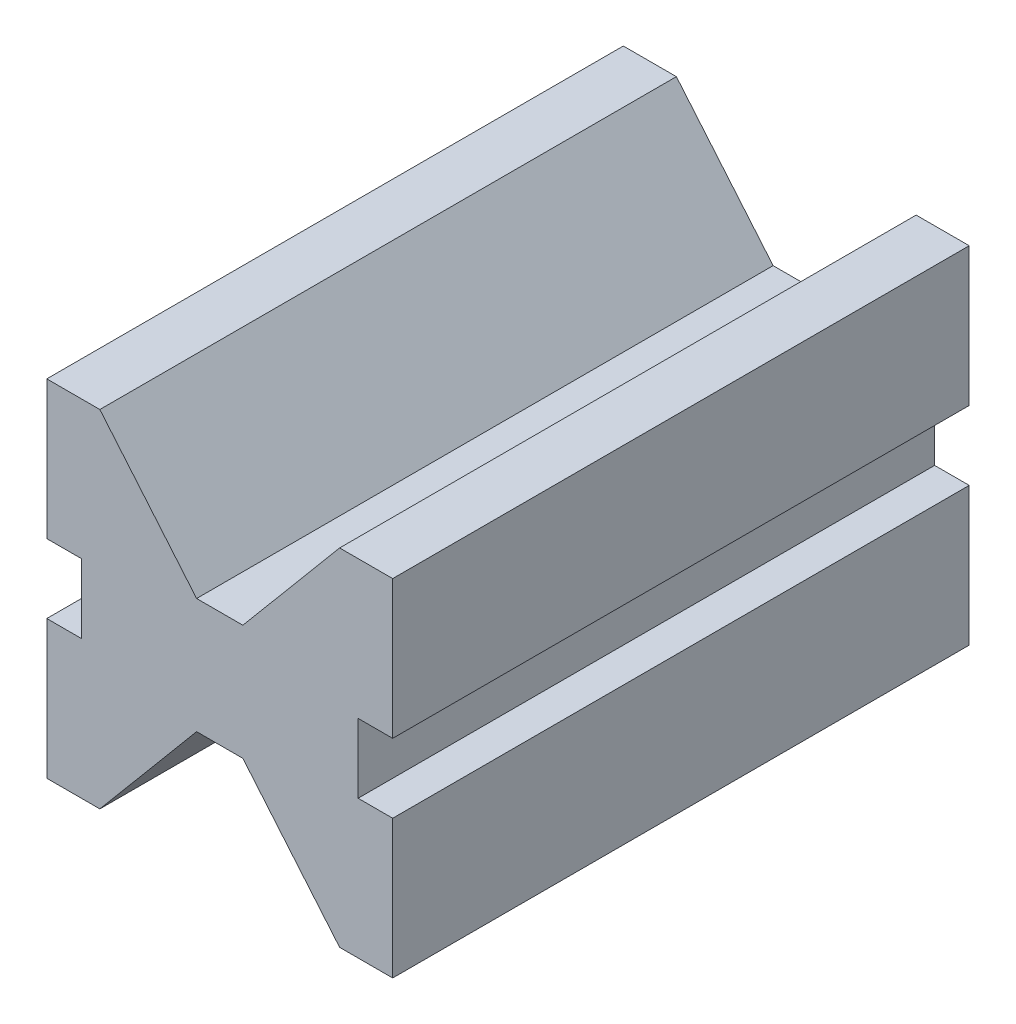
ISO-10303-21;
HEADER;
FILE_DESCRIPTION(('STEP AP214'),'2;1');
FILE_NAME('part.step','',(''),(''),'','','');
FILE_SCHEMA(('AUTOMOTIVE_DESIGN { 1 0 10303 214 1 1 1 1 }'));
ENDSEC;
DATA;
#1=APPLICATION_CONTEXT('core data for automotive mechanical design processes');
#2=APPLICATION_PROTOCOL_DEFINITION('international standard','automotive_design',2000,#1);
#3=PRODUCT_CONTEXT('',#1,'mechanical');
#4=PRODUCT('Part','Part','',(#3));
#5=PRODUCT_RELATED_PRODUCT_CATEGORY('part','',(#4));
#6=PRODUCT_DEFINITION_FORMATION('','',#4);
#7=PRODUCT_DEFINITION_CONTEXT('part definition',#1,'design');
#8=PRODUCT_DEFINITION('design','',#6,#7);
#9=PRODUCT_DEFINITION_SHAPE('','',#8);
#10=(LENGTH_UNIT() NAMED_UNIT(*) SI_UNIT(.MILLI.,.METRE.));
#11=(NAMED_UNIT(*) PLANE_ANGLE_UNIT() SI_UNIT($,.RADIAN.));
#12=(NAMED_UNIT(*) SI_UNIT($,.STERADIAN.) SOLID_ANGLE_UNIT());
#13=UNCERTAINTY_MEASURE_WITH_UNIT(LENGTH_MEASURE(1.E-05),#10,'distance_accuracy_value','');
#14=(GEOMETRIC_REPRESENTATION_CONTEXT(3) GLOBAL_UNCERTAINTY_ASSIGNED_CONTEXT((#13)) GLOBAL_UNIT_ASSIGNED_CONTEXT((#10,
#11,#12)) REPRESENTATION_CONTEXT('',''));
#15=CARTESIAN_POINT('',(0.,0.,0.));
#16=DIRECTION('',(0.,0.,1.));
#17=DIRECTION('',(1.,0.,0.));
#18=AXIS2_PLACEMENT_3D('',#15,#16,#17);
#19=CARTESIAN_POINT('',(0.,10.,50.));
#20=DIRECTION('',(0.,1.,0.));
#21=DIRECTION('',(0.,0.,1.));
#22=AXIS2_PLACEMENT_3D('',#19,#20,#21);
#23=PLANE('',#22);
#24=DIRECTION('',(1.,0.,0.));
#25=VECTOR('',#24,1.);
#26=CARTESIAN_POINT('',(0.,10.,-50.));
#27=LINE('',#26,#25);
#28=CARTESIAN_POINT('',(-4.01270936320944,10.,-50.));
#29=VERTEX_POINT('',#28);
#30=CARTESIAN_POINT('',(4.01270936320946,10.,-50.));
#31=VERTEX_POINT('',#30);
#32=EDGE_CURVE('E206',#29,#31,#27,.T.);
#33=ORIENTED_EDGE('',*,*,#32,.F.);
#34=DIRECTION('',(0.,0.,-1.));
#35=VECTOR('',#34,1.);
#36=CARTESIAN_POINT('',(-4.01270936320944,10.,50.));
#37=LINE('',#36,#35);
#38=CARTESIAN_POINT('',(-4.01270936320944,10.,50.));
#39=VERTEX_POINT('',#38);
#40=EDGE_CURVE('E11',#39,#29,#37,.T.);
#41=ORIENTED_EDGE('',*,*,#40,.F.);
#42=DIRECTION('',(1.,0.,0.));
#43=VECTOR('',#42,1.);
#44=CARTESIAN_POINT('',(0.,10.,50.));
#45=LINE('',#44,#43);
#46=CARTESIAN_POINT('',(4.01270936320946,10.,50.));
#47=VERTEX_POINT('',#46);
#48=EDGE_CURVE('E257',#39,#47,#45,.T.);
#49=ORIENTED_EDGE('',*,*,#48,.T.);
#50=DIRECTION('',(0.,0.,-1.));
#51=VECTOR('',#50,1.);
#52=CARTESIAN_POINT('',(4.01270936320946,10.,50.));
#53=LINE('',#52,#51);
#54=EDGE_CURVE('E127',#47,#31,#53,.T.);
#55=ORIENTED_EDGE('',*,*,#54,.T.);
#56=EDGE_LOOP('',(#33,#41,#49,#55));
#57=FACE_BOUND('',#56,.T.);
#58=ADVANCED_FACE('F41',(#57),#23,.T.);
#59=CARTESIAN_POINT('',(2.56928424924213,2.15588546592866,50.));
#60=DIRECTION('',(0.766044443118979,0.642787609686538,0.));
#61=DIRECTION('',(-0.642787609686538,0.766044443118979,0.));
#62=AXIS2_PLACEMENT_3D('',#59,#60,#61);
#63=PLANE('',#62);
#64=DIRECTION('',(0.642787609686538,-0.766044443118979,0.));
#65=VECTOR('',#64,1.);
#66=CARTESIAN_POINT('',(2.56928424924213,2.15588546592866,-50.));
#67=LINE('',#66,#65);
#68=CARTESIAN_POINT('',(-20.794701986755,30.,-50.));
#69=VERTEX_POINT('',#68);
#70=EDGE_CURVE('E209',#69,#29,#67,.T.);
#71=ORIENTED_EDGE('',*,*,#70,.F.);
#72=DIRECTION('',(0.,0.,-1.));
#73=VECTOR('',#72,1.);
#74=CARTESIAN_POINT('',(-20.794701986755,30.,50.));
#75=LINE('',#74,#73);
#76=CARTESIAN_POINT('',(-20.794701986755,30.,50.));
#77=VERTEX_POINT('',#76);
#78=EDGE_CURVE('E49',#77,#69,#75,.T.);
#79=ORIENTED_EDGE('',*,*,#78,.F.);
#80=DIRECTION('',(0.642787609686538,-0.766044443118979,0.));
#81=VECTOR('',#80,1.);
#82=CARTESIAN_POINT('',(2.56928424924213,2.15588546592866,50.));
#83=LINE('',#82,#81);
#84=EDGE_CURVE('E315',#77,#39,#83,.T.);
#85=ORIENTED_EDGE('',*,*,#84,.T.);
#86=ORIENTED_EDGE('',*,*,#40,.T.);
#87=EDGE_LOOP('',(#71,#79,#85,#86));
#88=FACE_BOUND('',#87,.T.);
#89=ADVANCED_FACE('F303',(#88),#63,.T.);
#90=CARTESIAN_POINT('',(0.,30.,50.));
#91=DIRECTION('',(0.,1.,0.));
#92=DIRECTION('',(0.,0.,1.));
#93=AXIS2_PLACEMENT_3D('',#90,#91,#92);
#94=PLANE('',#93);
#95=DIRECTION('',(1.,0.,0.));
#96=VECTOR('',#95,1.);
#97=CARTESIAN_POINT('',(0.,30.,-50.));
#98=LINE('',#97,#96);
#99=CARTESIAN_POINT('',(-30.,30.,-50.));
#100=VERTEX_POINT('',#99);
#101=EDGE_CURVE('E212',#100,#69,#98,.T.);
#102=ORIENTED_EDGE('',*,*,#101,.F.);
#103=DIRECTION('',(0.,0.,-1.));
#104=VECTOR('',#103,1.);
#105=CARTESIAN_POINT('',(-30.,30.,50.));
#106=LINE('',#105,#104);
#107=CARTESIAN_POINT('',(-30.,30.,50.));
#108=VERTEX_POINT('',#107);
#109=EDGE_CURVE('E292',#108,#100,#106,.T.);
#110=ORIENTED_EDGE('',*,*,#109,.F.);
#111=DIRECTION('',(1.,0.,0.));
#112=VECTOR('',#111,1.);
#113=CARTESIAN_POINT('',(0.,30.,50.));
#114=LINE('',#113,#112);
#115=EDGE_CURVE('E299',#108,#77,#114,.T.);
#116=ORIENTED_EDGE('',*,*,#115,.T.);
#117=ORIENTED_EDGE('',*,*,#78,.T.);
#118=EDGE_LOOP('',(#102,#110,#116,#117));
#119=FACE_BOUND('',#118,.T.);
#120=ADVANCED_FACE('F297',(#119),#94,.T.);
#121=CARTESIAN_POINT('',(-30.,0.,50.));
#122=DIRECTION('',(-1.,0.,0.));
#123=DIRECTION('',(0.,-1.,0.));
#124=AXIS2_PLACEMENT_3D('',#121,#122,#123);
#125=PLANE('',#124);
#126=DIRECTION('',(0.,1.,0.));
#127=VECTOR('',#126,1.);
#128=CARTESIAN_POINT('',(-30.,0.,-50.));
#129=LINE('',#128,#127);
#130=CARTESIAN_POINT('',(-30.,6.,-50.));
#131=VERTEX_POINT('',#130);
#132=EDGE_CURVE('E215',#131,#100,#129,.T.);
#133=ORIENTED_EDGE('',*,*,#132,.F.);
#134=DIRECTION('',(0.,0.,-1.));
#135=VECTOR('',#134,1.);
#136=CARTESIAN_POINT('',(-30.,6.,50.));
#137=LINE('',#136,#135);
#138=CARTESIAN_POINT('',(-30.,6.,50.));
#139=VERTEX_POINT('',#138);
#140=EDGE_CURVE('E290',#139,#131,#137,.T.);
#141=ORIENTED_EDGE('',*,*,#140,.F.);
#142=DIRECTION('',(0.,1.,0.));
#143=VECTOR('',#142,1.);
#144=CARTESIAN_POINT('',(-30.,0.,50.));
#145=LINE('',#144,#143);
#146=EDGE_CURVE('E314',#139,#108,#145,.T.);
#147=ORIENTED_EDGE('',*,*,#146,.T.);
#148=ORIENTED_EDGE('',*,*,#109,.T.);
#149=EDGE_LOOP('',(#133,#141,#147,#148));
#150=FACE_BOUND('',#149,.T.);
#151=ADVANCED_FACE('F310',(#150),#125,.T.);
#152=CARTESIAN_POINT('',(0.,6.,50.));
#153=DIRECTION('',(0.,1.,0.));
#154=DIRECTION('',(0.,0.,1.));
#155=AXIS2_PLACEMENT_3D('',#152,#153,#154);
#156=PLANE('',#155);
#157=DIRECTION('',(1.,0.,0.));
#158=VECTOR('',#157,1.);
#159=CARTESIAN_POINT('',(0.,6.,-50.));
#160=LINE('',#159,#158);
#161=CARTESIAN_POINT('',(-24.,6.,-50.));
#162=VERTEX_POINT('',#161);
#163=EDGE_CURVE('E218',#131,#162,#160,.T.);
#164=ORIENTED_EDGE('',*,*,#163,.T.);
#165=DIRECTION('',(0.,0.,-1.));
#166=VECTOR('',#165,1.);
#167=CARTESIAN_POINT('',(-24.,6.,50.));
#168=LINE('',#167,#166);
#169=CARTESIAN_POINT('',(-24.,6.,50.));
#170=VERTEX_POINT('',#169);
#171=EDGE_CURVE('E287',#170,#162,#168,.T.);
#172=ORIENTED_EDGE('',*,*,#171,.F.);
#173=DIRECTION('',(1.,0.,0.));
#174=VECTOR('',#173,1.);
#175=CARTESIAN_POINT('',(0.,6.,50.));
#176=LINE('',#175,#174);
#177=EDGE_CURVE('E317',#139,#170,#176,.T.);
#178=ORIENTED_EDGE('',*,*,#177,.F.);
#179=ORIENTED_EDGE('',*,*,#140,.T.);
#180=EDGE_LOOP('',(#164,#172,#178,#179));
#181=FACE_BOUND('',#180,.T.);
#182=ADVANCED_FACE('F364',(#181),#156,.F.);
#183=CARTESIAN_POINT('',(-24.,0.,50.));
#184=DIRECTION('',(1.,0.,0.));
#185=DIRECTION('',(0.,0.,-1.));
#186=AXIS2_PLACEMENT_3D('',#183,#184,#185);
#187=PLANE('',#186);
#188=DIRECTION('',(0.,-1.,0.));
#189=VECTOR('',#188,1.);
#190=CARTESIAN_POINT('',(-24.,0.,-50.));
#191=LINE('',#190,#189);
#192=CARTESIAN_POINT('',(-24.,-6.,-50.));
#193=VERTEX_POINT('',#192);
#194=EDGE_CURVE('E220',#162,#193,#191,.T.);
#195=ORIENTED_EDGE('',*,*,#194,.T.);
#196=DIRECTION('',(0.,0.,-1.));
#197=VECTOR('',#196,1.);
#198=CARTESIAN_POINT('',(-24.,-6.,50.));
#199=LINE('',#198,#197);
#200=CARTESIAN_POINT('',(-24.,-6.,50.));
#201=VERTEX_POINT('',#200);
#202=EDGE_CURVE('E284',#201,#193,#199,.T.);
#203=ORIENTED_EDGE('',*,*,#202,.F.);
#204=DIRECTION('',(0.,-1.,0.));
#205=VECTOR('',#204,1.);
#206=CARTESIAN_POINT('',(-24.,0.,50.));
#207=LINE('',#206,#205);
#208=EDGE_CURVE('E323',#170,#201,#207,.T.);
#209=ORIENTED_EDGE('',*,*,#208,.F.);
#210=ORIENTED_EDGE('',*,*,#171,.T.);
#211=EDGE_LOOP('',(#195,#203,#209,#210));
#212=FACE_BOUND('',#211,.T.);
#213=ADVANCED_FACE('F367',(#212),#187,.F.);
#214=CARTESIAN_POINT('',(0.,-6.,50.));
#215=DIRECTION('',(0.,-1.,0.));
#216=DIRECTION('',(0.,0.,-1.));
#217=AXIS2_PLACEMENT_3D('',#214,#215,#216);
#218=PLANE('',#217);
#219=DIRECTION('',(-1.,0.,0.));
#220=VECTOR('',#219,1.);
#221=CARTESIAN_POINT('',(0.,-6.,-50.));
#222=LINE('',#221,#220);
#223=CARTESIAN_POINT('',(-30.,-6.,-50.));
#224=VERTEX_POINT('',#223);
#225=EDGE_CURVE('E222',#193,#224,#222,.T.);
#226=ORIENTED_EDGE('',*,*,#225,.T.);
#227=DIRECTION('',(0.,0.,-1.));
#228=VECTOR('',#227,1.);
#229=CARTESIAN_POINT('',(-30.,-6.,50.));
#230=LINE('',#229,#228);
#231=CARTESIAN_POINT('',(-30.,-6.,50.));
#232=VERTEX_POINT('',#231);
#233=EDGE_CURVE('E282',#232,#224,#230,.T.);
#234=ORIENTED_EDGE('',*,*,#233,.F.);
#235=DIRECTION('',(-1.,0.,0.));
#236=VECTOR('',#235,1.);
#237=CARTESIAN_POINT('',(0.,-6.,50.));
#238=LINE('',#237,#236);
#239=EDGE_CURVE('E325',#201,#232,#238,.T.);
#240=ORIENTED_EDGE('',*,*,#239,.F.);
#241=ORIENTED_EDGE('',*,*,#202,.T.);
#242=EDGE_LOOP('',(#226,#234,#240,#241));
#243=FACE_BOUND('',#242,.T.);
#244=ADVANCED_FACE('F371',(#243),#218,.F.);
#245=CARTESIAN_POINT('',(-30.,0.,50.));
#246=DIRECTION('',(-1.,0.,0.));
#247=DIRECTION('',(0.,0.,1.));
#248=AXIS2_PLACEMENT_3D('',#245,#246,#247);
#249=PLANE('',#248);
#250=DIRECTION('',(0.,1.,0.));
#251=VECTOR('',#250,1.);
#252=CARTESIAN_POINT('',(-30.,0.,-50.));
#253=LINE('',#252,#251);
#254=CARTESIAN_POINT('',(-30.,-30.,-50.));
#255=VERTEX_POINT('',#254);
#256=EDGE_CURVE('E225',#255,#224,#253,.T.);
#257=ORIENTED_EDGE('',*,*,#256,.F.);
#258=DIRECTION('',(0.,0.,-1.));
#259=VECTOR('',#258,1.);
#260=CARTESIAN_POINT('',(-30.,-30.,50.));
#261=LINE('',#260,#259);
#262=CARTESIAN_POINT('',(-30.,-30.,50.));
#263=VERTEX_POINT('',#262);
#264=EDGE_CURVE('E280',#263,#255,#261,.T.);
#265=ORIENTED_EDGE('',*,*,#264,.F.);
#266=DIRECTION('',(0.,1.,0.));
#267=VECTOR('',#266,1.);
#268=CARTESIAN_POINT('',(-30.,0.,50.));
#269=LINE('',#268,#267);
#270=EDGE_CURVE('E327',#263,#232,#269,.T.);
#271=ORIENTED_EDGE('',*,*,#270,.T.);
#272=ORIENTED_EDGE('',*,*,#233,.T.);
#273=EDGE_LOOP('',(#257,#265,#271,#272));
#274=FACE_BOUND('',#273,.T.);
#275=ADVANCED_FACE('F375',(#274),#249,.T.);
#276=CARTESIAN_POINT('',(0.,-30.,50.));
#277=DIRECTION('',(0.,1.,0.));
#278=DIRECTION('',(0.,0.,1.));
#279=AXIS2_PLACEMENT_3D('',#276,#277,#278);
#280=PLANE('',#279);
#281=DIRECTION('',(1.,0.,0.));
#282=VECTOR('',#281,1.);
#283=CARTESIAN_POINT('',(0.,-30.,-50.));
#284=LINE('',#283,#282);
#285=CARTESIAN_POINT('',(-20.794701986755,-30.,-50.));
#286=VERTEX_POINT('',#285);
#287=EDGE_CURVE('E228',#255,#286,#284,.T.);
#288=ORIENTED_EDGE('',*,*,#287,.T.);
#289=DIRECTION('',(0.,0.,-1.));
#290=VECTOR('',#289,1.);
#291=CARTESIAN_POINT('',(-20.794701986755,-30.,50.));
#292=LINE('',#291,#290);
#293=CARTESIAN_POINT('',(-20.794701986755,-30.,50.));
#294=VERTEX_POINT('',#293);
#295=EDGE_CURVE('E277',#294,#286,#292,.T.);
#296=ORIENTED_EDGE('',*,*,#295,.F.);
#297=DIRECTION('',(1.,0.,0.));
#298=VECTOR('',#297,1.);
#299=CARTESIAN_POINT('',(0.,-30.,50.));
#300=LINE('',#299,#298);
#301=EDGE_CURVE('E330',#263,#294,#300,.T.);
#302=ORIENTED_EDGE('',*,*,#301,.F.);
#303=ORIENTED_EDGE('',*,*,#264,.T.);
#304=EDGE_LOOP('',(#288,#296,#302,#303));
#305=FACE_BOUND('',#304,.T.);
#306=ADVANCED_FACE('F379',(#305),#280,.F.);
#307=CARTESIAN_POINT('',(2.56928424924213,-2.15588546592866,50.));
#308=DIRECTION('',(-0.766044443118979,0.642787609686538,0.));
#309=DIRECTION('',(-0.642787609686538,-0.766044443118979,0.));
#310=AXIS2_PLACEMENT_3D('',#307,#308,#309);
#311=PLANE('',#310);
#312=DIRECTION('',(0.642787609686538,0.766044443118979,0.));
#313=VECTOR('',#312,1.);
#314=CARTESIAN_POINT('',(2.56928424924213,-2.15588546592866,-50.));
#315=LINE('',#314,#313);
#316=CARTESIAN_POINT('',(-4.01270936320944,-10.,-50.));
#317=VERTEX_POINT('',#316);
#318=EDGE_CURVE('E230',#286,#317,#315,.T.);
#319=ORIENTED_EDGE('',*,*,#318,.T.);
#320=DIRECTION('',(0.,0.,-1.));
#321=VECTOR('',#320,1.);
#322=CARTESIAN_POINT('',(-4.01270936320944,-10.,50.));
#323=LINE('',#322,#321);
#324=CARTESIAN_POINT('',(-4.01270936320944,-10.,50.));
#325=VERTEX_POINT('',#324);
#326=EDGE_CURVE('E274',#325,#317,#323,.T.);
#327=ORIENTED_EDGE('',*,*,#326,.F.);
#328=DIRECTION('',(0.642787609686538,0.766044443118979,0.));
#329=VECTOR('',#328,1.);
#330=CARTESIAN_POINT('',(2.56928424924213,-2.15588546592866,50.));
#331=LINE('',#330,#329);
#332=EDGE_CURVE('E332',#294,#325,#331,.T.);
#333=ORIENTED_EDGE('',*,*,#332,.F.);
#334=ORIENTED_EDGE('',*,*,#295,.T.);
#335=EDGE_LOOP('',(#319,#327,#333,#334));
#336=FACE_BOUND('',#335,.T.);
#337=ADVANCED_FACE('F383',(#336),#311,.F.);
#338=CARTESIAN_POINT('',(0.,-10.,50.));
#339=DIRECTION('',(0.,1.,0.));
#340=DIRECTION('',(0.,0.,1.));
#341=AXIS2_PLACEMENT_3D('',#338,#339,#340);
#342=PLANE('',#341);
#343=DIRECTION('',(1.,0.,0.));
#344=VECTOR('',#343,1.);
#345=CARTESIAN_POINT('',(0.,-10.,-50.));
#346=LINE('',#345,#344);
#347=CARTESIAN_POINT('',(4.01270936320946,-10.,-50.));
#348=VERTEX_POINT('',#347);
#349=EDGE_CURVE('E232',#317,#348,#346,.T.);
#350=ORIENTED_EDGE('',*,*,#349,.T.);
#351=DIRECTION('',(0.,0.,-1.));
#352=VECTOR('',#351,1.);
#353=CARTESIAN_POINT('',(4.01270936320946,-10.,50.));
#354=LINE('',#353,#352);
#355=CARTESIAN_POINT('',(4.01270936320946,-10.,50.));
#356=VERTEX_POINT('',#355);
#357=EDGE_CURVE('E272',#356,#348,#354,.T.);
#358=ORIENTED_EDGE('',*,*,#357,.F.);
#359=DIRECTION('',(1.,0.,0.));
#360=VECTOR('',#359,1.);
#361=CARTESIAN_POINT('',(0.,-10.,50.));
#362=LINE('',#361,#360);
#363=EDGE_CURVE('E334',#325,#356,#362,.T.);
#364=ORIENTED_EDGE('',*,*,#363,.F.);
#365=ORIENTED_EDGE('',*,*,#326,.T.);
#366=EDGE_LOOP('',(#350,#358,#364,#365));
#367=FACE_BOUND('',#366,.T.);
#368=ADVANCED_FACE('F387',(#367),#342,.F.);
#369=CARTESIAN_POINT('',(-2.56928424924212,-2.15588546592865,50.));
#370=DIRECTION('',(-0.766044443118979,-0.642787609686538,0.));
#371=DIRECTION('',(0.642787609686538,-0.766044443118979,0.));
#372=AXIS2_PLACEMENT_3D('',#369,#370,#371);
#373=PLANE('',#372);
#374=DIRECTION('',(-0.642787609686538,0.766044443118979,0.));
#375=VECTOR('',#374,1.);
#376=CARTESIAN_POINT('',(-2.56928424924212,-2.15588546592865,-50.));
#377=LINE('',#376,#375);
#378=CARTESIAN_POINT('',(20.794701986755,-30.,-50.));
#379=VERTEX_POINT('',#378);
#380=EDGE_CURVE('E235',#379,#348,#377,.T.);
#381=ORIENTED_EDGE('',*,*,#380,.F.);
#382=DIRECTION('',(0.,0.,-1.));
#383=VECTOR('',#382,1.);
#384=CARTESIAN_POINT('',(20.794701986755,-30.,50.));
#385=LINE('',#384,#383);
#386=CARTESIAN_POINT('',(20.794701986755,-30.,50.));
#387=VERTEX_POINT('',#386);
#388=EDGE_CURVE('E270',#387,#379,#385,.T.);
#389=ORIENTED_EDGE('',*,*,#388,.F.);
#390=DIRECTION('',(-0.642787609686538,0.766044443118979,0.));
#391=VECTOR('',#390,1.);
#392=CARTESIAN_POINT('',(-2.56928424924212,-2.15588546592865,50.));
#393=LINE('',#392,#391);
#394=EDGE_CURVE('E336',#387,#356,#393,.T.);
#395=ORIENTED_EDGE('',*,*,#394,.T.);
#396=ORIENTED_EDGE('',*,*,#357,.T.);
#397=EDGE_LOOP('',(#381,#389,#395,#396));
#398=FACE_BOUND('',#397,.T.);
#399=ADVANCED_FACE('F391',(#398),#373,.T.);
#400=CARTESIAN_POINT('',(0.,-30.,50.));
#401=DIRECTION('',(0.,1.,0.));
#402=DIRECTION('',(0.,0.,1.));
#403=AXIS2_PLACEMENT_3D('',#400,#401,#402);
#404=PLANE('',#403);
#405=DIRECTION('',(1.,0.,0.));
#406=VECTOR('',#405,1.);
#407=CARTESIAN_POINT('',(0.,-30.,-50.));
#408=LINE('',#407,#406);
#409=CARTESIAN_POINT('',(30.,-30.,-50.));
#410=VERTEX_POINT('',#409);
#411=EDGE_CURVE('E238',#379,#410,#408,.T.);
#412=ORIENTED_EDGE('',*,*,#411,.T.);
#413=DIRECTION('',(0.,0.,-1.));
#414=VECTOR('',#413,1.);
#415=CARTESIAN_POINT('',(30.,-30.,50.));
#416=LINE('',#415,#414);
#417=CARTESIAN_POINT('',(30.,-30.,50.));
#418=VERTEX_POINT('',#417);
#419=EDGE_CURVE('E267',#418,#410,#416,.T.);
#420=ORIENTED_EDGE('',*,*,#419,.F.);
#421=DIRECTION('',(1.,0.,0.));
#422=VECTOR('',#421,1.);
#423=CARTESIAN_POINT('',(0.,-30.,50.));
#424=LINE('',#423,#422);
#425=EDGE_CURVE('E339',#387,#418,#424,.T.);
#426=ORIENTED_EDGE('',*,*,#425,.F.);
#427=ORIENTED_EDGE('',*,*,#388,.T.);
#428=EDGE_LOOP('',(#412,#420,#426,#427));
#429=FACE_BOUND('',#428,.T.);
#430=ADVANCED_FACE('F395',(#429),#404,.F.);
#431=CARTESIAN_POINT('',(30.,0.,50.));
#432=DIRECTION('',(-1.,0.,0.));
#433=DIRECTION('',(0.,0.,1.));
#434=AXIS2_PLACEMENT_3D('',#431,#432,#433);
#435=PLANE('',#434);
#436=DIRECTION('',(0.,1.,0.));
#437=VECTOR('',#436,1.);
#438=CARTESIAN_POINT('',(30.,0.,-50.));
#439=LINE('',#438,#437);
#440=CARTESIAN_POINT('',(30.,-6.,-50.));
#441=VERTEX_POINT('',#440);
#442=EDGE_CURVE('E240',#410,#441,#439,.T.);
#443=ORIENTED_EDGE('',*,*,#442,.T.);
#444=DIRECTION('',(0.,0.,-1.));
#445=VECTOR('',#444,1.);
#446=CARTESIAN_POINT('',(30.,-6.,50.));
#447=LINE('',#446,#445);
#448=CARTESIAN_POINT('',(30.,-6.,50.));
#449=VERTEX_POINT('',#448);
#450=EDGE_CURVE('E265',#449,#441,#447,.T.);
#451=ORIENTED_EDGE('',*,*,#450,.F.);
#452=DIRECTION('',(0.,1.,0.));
#453=VECTOR('',#452,1.);
#454=CARTESIAN_POINT('',(30.,0.,50.));
#455=LINE('',#454,#453);
#456=EDGE_CURVE('E341',#418,#449,#455,.T.);
#457=ORIENTED_EDGE('',*,*,#456,.F.);
#458=ORIENTED_EDGE('',*,*,#419,.T.);
#459=EDGE_LOOP('',(#443,#451,#457,#458));
#460=FACE_BOUND('',#459,.T.);
#461=ADVANCED_FACE('F399',(#460),#435,.F.);
#462=CARTESIAN_POINT('',(0.,-6.,50.));
#463=DIRECTION('',(0.,1.,0.));
#464=DIRECTION('',(0.,0.,1.));
#465=AXIS2_PLACEMENT_3D('',#462,#463,#464);
#466=PLANE('',#465);
#467=DIRECTION('',(1.,0.,0.));
#468=VECTOR('',#467,1.);
#469=CARTESIAN_POINT('',(0.,-6.,-50.));
#470=LINE('',#469,#468);
#471=CARTESIAN_POINT('',(24.,-6.,-50.));
#472=VERTEX_POINT('',#471);
#473=EDGE_CURVE('E243',#472,#441,#470,.T.);
#474=ORIENTED_EDGE('',*,*,#473,.F.);
#475=DIRECTION('',(0.,0.,-1.));
#476=VECTOR('',#475,1.);
#477=CARTESIAN_POINT('',(24.,-6.,50.));
#478=LINE('',#477,#476);
#479=CARTESIAN_POINT('',(24.,-6.,50.));
#480=VERTEX_POINT('',#479);
#481=EDGE_CURVE('E263',#480,#472,#478,.T.);
#482=ORIENTED_EDGE('',*,*,#481,.F.);
#483=DIRECTION('',(1.,0.,0.));
#484=VECTOR('',#483,1.);
#485=CARTESIAN_POINT('',(0.,-6.,50.));
#486=LINE('',#485,#484);
#487=EDGE_CURVE('E343',#480,#449,#486,.T.);
#488=ORIENTED_EDGE('',*,*,#487,.T.);
#489=ORIENTED_EDGE('',*,*,#450,.T.);
#490=EDGE_LOOP('',(#474,#482,#488,#489));
#491=FACE_BOUND('',#490,.T.);
#492=ADVANCED_FACE('F403',(#491),#466,.T.);
#493=CARTESIAN_POINT('',(24.,0.,50.));
#494=DIRECTION('',(1.,0.,0.));
#495=DIRECTION('',(0.,0.,-1.));
#496=AXIS2_PLACEMENT_3D('',#493,#494,#495);
#497=PLANE('',#496);
#498=DIRECTION('',(0.,-1.,0.));
#499=VECTOR('',#498,1.);
#500=CARTESIAN_POINT('',(24.,0.,-50.));
#501=LINE('',#500,#499);
#502=CARTESIAN_POINT('',(24.,6.,-50.));
#503=VERTEX_POINT('',#502);
#504=EDGE_CURVE('E246',#503,#472,#501,.T.);
#505=ORIENTED_EDGE('',*,*,#504,.F.);
#506=DIRECTION('',(0.,0.,-1.));
#507=VECTOR('',#506,1.);
#508=CARTESIAN_POINT('',(24.,6.,50.));
#509=LINE('',#508,#507);
#510=CARTESIAN_POINT('',(24.,6.,50.));
#511=VERTEX_POINT('',#510);
#512=EDGE_CURVE('E261',#511,#503,#509,.T.);
#513=ORIENTED_EDGE('',*,*,#512,.F.);
#514=DIRECTION('',(0.,-1.,0.));
#515=VECTOR('',#514,1.);
#516=CARTESIAN_POINT('',(24.,0.,50.));
#517=LINE('',#516,#515);
#518=EDGE_CURVE('E346',#511,#480,#517,.T.);
#519=ORIENTED_EDGE('',*,*,#518,.T.);
#520=ORIENTED_EDGE('',*,*,#481,.T.);
#521=EDGE_LOOP('',(#505,#513,#519,#520));
#522=FACE_BOUND('',#521,.T.);
#523=ADVANCED_FACE('F407',(#522),#497,.T.);
#524=CARTESIAN_POINT('',(0.,6.,50.));
#525=DIRECTION('',(0.,-1.,0.));
#526=DIRECTION('',(0.,0.,-1.));
#527=AXIS2_PLACEMENT_3D('',#524,#525,#526);
#528=PLANE('',#527);
#529=DIRECTION('',(-1.,0.,0.));
#530=VECTOR('',#529,1.);
#531=CARTESIAN_POINT('',(0.,6.,-50.));
#532=LINE('',#531,#530);
#533=CARTESIAN_POINT('',(30.,6.,-50.));
#534=VERTEX_POINT('',#533);
#535=EDGE_CURVE('E249',#534,#503,#532,.T.);
#536=ORIENTED_EDGE('',*,*,#535,.F.);
#537=DIRECTION('',(0.,0.,-1.));
#538=VECTOR('',#537,1.);
#539=CARTESIAN_POINT('',(30.,6.,50.));
#540=LINE('',#539,#538);
#541=CARTESIAN_POINT('',(30.,6.,50.));
#542=VERTEX_POINT('',#541);
#543=EDGE_CURVE('E199',#542,#534,#540,.T.);
#544=ORIENTED_EDGE('',*,*,#543,.F.);
#545=DIRECTION('',(-1.,0.,0.));
#546=VECTOR('',#545,1.);
#547=CARTESIAN_POINT('',(0.,6.,50.));
#548=LINE('',#547,#546);
#549=EDGE_CURVE('E188',#542,#511,#548,.T.);
#550=ORIENTED_EDGE('',*,*,#549,.T.);
#551=ORIENTED_EDGE('',*,*,#512,.T.);
#552=EDGE_LOOP('',(#536,#544,#550,#551));
#553=FACE_BOUND('',#552,.T.);
#554=ADVANCED_FACE('F350',(#553),#528,.T.);
#555=CARTESIAN_POINT('',(30.,0.,50.));
#556=DIRECTION('',(-1.,0.,0.));
#557=DIRECTION('',(0.,-1.,0.));
#558=AXIS2_PLACEMENT_3D('',#555,#556,#557);
#559=PLANE('',#558);
#560=DIRECTION('',(0.,1.,0.));
#561=VECTOR('',#560,1.);
#562=CARTESIAN_POINT('',(30.,0.,-50.));
#563=LINE('',#562,#561);
#564=CARTESIAN_POINT('',(30.,30.,-50.));
#565=VERTEX_POINT('',#564);
#566=EDGE_CURVE('E195',#534,#565,#563,.T.);
#567=ORIENTED_EDGE('',*,*,#566,.T.);
#568=DIRECTION('',(0.,0.,-1.));
#569=VECTOR('',#568,1.);
#570=CARTESIAN_POINT('',(30.,30.,50.));
#571=LINE('',#570,#569);
#572=CARTESIAN_POINT('',(30.,30.,50.));
#573=VERTEX_POINT('',#572);
#574=EDGE_CURVE('E192',#573,#565,#571,.T.);
#575=ORIENTED_EDGE('',*,*,#574,.F.);
#576=DIRECTION('',(0.,1.,0.));
#577=VECTOR('',#576,1.);
#578=CARTESIAN_POINT('',(30.,0.,50.));
#579=LINE('',#578,#577);
#580=EDGE_CURVE('E181',#542,#573,#579,.T.);
#581=ORIENTED_EDGE('',*,*,#580,.F.);
#582=ORIENTED_EDGE('',*,*,#543,.T.);
#583=EDGE_LOOP('',(#567,#575,#581,#582));
#584=FACE_BOUND('',#583,.T.);
#585=ADVANCED_FACE('F193',(#584),#559,.F.);
#586=CARTESIAN_POINT('',(0.,30.,50.));
#587=DIRECTION('',(0.,1.,0.));
#588=DIRECTION('',(0.,0.,1.));
#589=AXIS2_PLACEMENT_3D('',#586,#587,#588);
#590=PLANE('',#589);
#591=DIRECTION('',(1.,0.,0.));
#592=VECTOR('',#591,1.);
#593=CARTESIAN_POINT('',(0.,30.,-50.));
#594=LINE('',#593,#592);
#595=CARTESIAN_POINT('',(20.794701986755,30.,-50.));
#596=VERTEX_POINT('',#595);
#597=EDGE_CURVE('E253',#596,#565,#594,.T.);
#598=ORIENTED_EDGE('',*,*,#597,.F.);
#599=DIRECTION('',(0.,0.,-1.));
#600=VECTOR('',#599,1.);
#601=CARTESIAN_POINT('',(20.794701986755,30.,50.));
#602=LINE('',#601,#600);
#603=CARTESIAN_POINT('',(20.794701986755,30.,50.));
#604=VERTEX_POINT('',#603);
#605=EDGE_CURVE('E120',#604,#596,#602,.T.);
#606=ORIENTED_EDGE('',*,*,#605,.F.);
#607=DIRECTION('',(1.,0.,0.));
#608=VECTOR('',#607,1.);
#609=CARTESIAN_POINT('',(0.,30.,50.));
#610=LINE('',#609,#608);
#611=EDGE_CURVE('E185',#604,#573,#610,.T.);
#612=ORIENTED_EDGE('',*,*,#611,.T.);
#613=ORIENTED_EDGE('',*,*,#574,.T.);
#614=EDGE_LOOP('',(#598,#606,#612,#613));
#615=FACE_BOUND('',#614,.T.);
#616=ADVANCED_FACE('F201',(#615),#590,.T.);
#617=CARTESIAN_POINT('',(-2.56928424924213,2.15588546592865,50.));
#618=DIRECTION('',(0.766044443118979,-0.642787609686538,0.));
#619=DIRECTION('',(0.642787609686538,0.766044443118979,0.));
#620=AXIS2_PLACEMENT_3D('',#617,#618,#619);
#621=PLANE('',#620);
#622=DIRECTION('',(-0.642787609686538,-0.766044443118979,0.));
#623=VECTOR('',#622,1.);
#624=CARTESIAN_POINT('',(-2.56928424924213,2.15588546592865,-50.));
#625=LINE('',#624,#623);
#626=EDGE_CURVE('E255',#596,#31,#625,.T.);
#627=ORIENTED_EDGE('',*,*,#626,.T.);
#628=ORIENTED_EDGE('',*,*,#54,.F.);
#629=DIRECTION('',(-0.642787609686538,-0.766044443118979,0.));
#630=VECTOR('',#629,1.);
#631=CARTESIAN_POINT('',(-2.56928424924213,2.15588546592865,50.));
#632=LINE('',#631,#630);
#633=EDGE_CURVE('E57',#604,#47,#632,.T.);
#634=ORIENTED_EDGE('',*,*,#633,.F.);
#635=ORIENTED_EDGE('',*,*,#605,.T.);
#636=EDGE_LOOP('',(#627,#628,#634,#635));
#637=FACE_BOUND('',#636,.T.);
#638=ADVANCED_FACE('F352',(#637),#621,.F.);
#639=CARTESIAN_POINT('',(0.,0.,50.));
#640=DIRECTION('',(0.,0.,1.));
#641=DIRECTION('',(1.,0.,0.));
#642=AXIS2_PLACEMENT_3D('',#639,#640,#641);
#643=PLANE('',#642);
#644=ORIENTED_EDGE('',*,*,#48,.F.);
#645=ORIENTED_EDGE('',*,*,#84,.F.);
#646=ORIENTED_EDGE('',*,*,#115,.F.);
#647=ORIENTED_EDGE('',*,*,#146,.F.);
#648=ORIENTED_EDGE('',*,*,#177,.T.);
#649=ORIENTED_EDGE('',*,*,#208,.T.);
#650=ORIENTED_EDGE('',*,*,#239,.T.);
#651=ORIENTED_EDGE('',*,*,#270,.F.);
#652=ORIENTED_EDGE('',*,*,#301,.T.);
#653=ORIENTED_EDGE('',*,*,#332,.T.);
#654=ORIENTED_EDGE('',*,*,#363,.T.);
#655=ORIENTED_EDGE('',*,*,#394,.F.);
#656=ORIENTED_EDGE('',*,*,#425,.T.);
#657=ORIENTED_EDGE('',*,*,#456,.T.);
#658=ORIENTED_EDGE('',*,*,#487,.F.);
#659=ORIENTED_EDGE('',*,*,#518,.F.);
#660=ORIENTED_EDGE('',*,*,#549,.F.);
#661=ORIENTED_EDGE('',*,*,#580,.T.);
#662=ORIENTED_EDGE('',*,*,#611,.F.);
#663=ORIENTED_EDGE('',*,*,#633,.T.);
#664=EDGE_LOOP('',(#644,#645,#646,#647,#648,#649,#650,#651,#652,#653,#654,#655,#656,#657,#658,
#659,#660,#661,#662,#663));
#665=FACE_BOUND('',#664,.T.);
#666=ADVANCED_FACE('F183',(#665),#643,.T.);
#667=CARTESIAN_POINT('',(0.,0.,-50.));
#668=DIRECTION('',(0.,0.,1.));
#669=DIRECTION('',(1.,0.,0.));
#670=AXIS2_PLACEMENT_3D('',#667,#668,#669);
#671=PLANE('',#670);
#672=ORIENTED_EDGE('',*,*,#32,.T.);
#673=ORIENTED_EDGE('',*,*,#626,.F.);
#674=ORIENTED_EDGE('',*,*,#597,.T.);
#675=ORIENTED_EDGE('',*,*,#566,.F.);
#676=ORIENTED_EDGE('',*,*,#535,.T.);
#677=ORIENTED_EDGE('',*,*,#504,.T.);
#678=ORIENTED_EDGE('',*,*,#473,.T.);
#679=ORIENTED_EDGE('',*,*,#442,.F.);
#680=ORIENTED_EDGE('',*,*,#411,.F.);
#681=ORIENTED_EDGE('',*,*,#380,.T.);
#682=ORIENTED_EDGE('',*,*,#349,.F.);
#683=ORIENTED_EDGE('',*,*,#318,.F.);
#684=ORIENTED_EDGE('',*,*,#287,.F.);
#685=ORIENTED_EDGE('',*,*,#256,.T.);
#686=ORIENTED_EDGE('',*,*,#225,.F.);
#687=ORIENTED_EDGE('',*,*,#194,.F.);
#688=ORIENTED_EDGE('',*,*,#163,.F.);
#689=ORIENTED_EDGE('',*,*,#132,.T.);
#690=ORIENTED_EDGE('',*,*,#101,.T.);
#691=ORIENTED_EDGE('',*,*,#70,.T.);
#692=EDGE_LOOP('',(#672,#673,#674,#675,#676,#677,#678,#679,#680,#681,#682,#683,#684,#685,#686,
#687,#688,#689,#690,#691));
#693=FACE_BOUND('',#692,.T.);
#694=ADVANCED_FACE('F305',(#693),#671,.F.);
#695=CLOSED_SHELL('',(#58,#89,#120,#151,#182,#213,#244,#275,#306,#337,#368,#399,#430,#461,#492,
#523,#554,#585,#616,#638,#666,#694));
#696=MANIFOLD_SOLID_BREP('B2',#695);
#697=ADVANCED_BREP_SHAPE_REPRESENTATION('',(#18,#696),#14);
#698=SHAPE_DEFINITION_REPRESENTATION(#9,#697);
ENDSEC;
END-ISO-10303-21;
